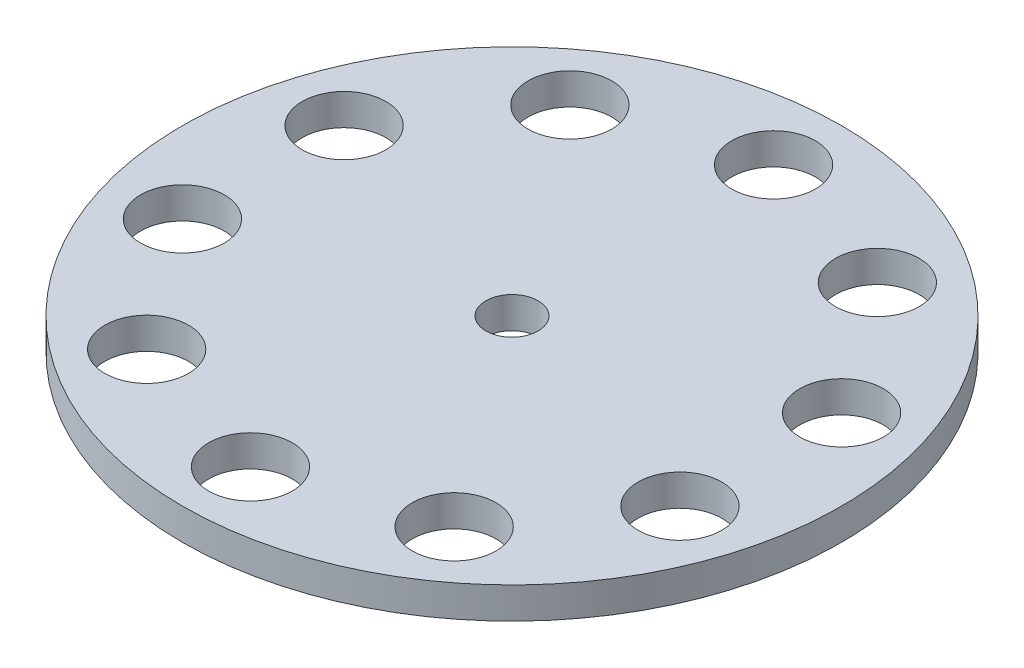
ISO-10303-21;
HEADER;
FILE_DESCRIPTION(('STEP AP214'),'2;1');
FILE_NAME('part.step','',(''),(''),'','','');
FILE_SCHEMA(('AUTOMOTIVE_DESIGN { 1 0 10303 214 1 1 1 1 }'));
ENDSEC;
DATA;
#1=APPLICATION_CONTEXT('core data for automotive mechanical design processes');
#2=APPLICATION_PROTOCOL_DEFINITION('international standard','automotive_design',2000,#1);
#3=PRODUCT_CONTEXT('',#1,'mechanical');
#4=PRODUCT('Part','Part','',(#3));
#5=PRODUCT_RELATED_PRODUCT_CATEGORY('part','',(#4));
#6=PRODUCT_DEFINITION_FORMATION('','',#4);
#7=PRODUCT_DEFINITION_CONTEXT('part definition',#1,'design');
#8=PRODUCT_DEFINITION('design','',#6,#7);
#9=PRODUCT_DEFINITION_SHAPE('','',#8);
#10=(LENGTH_UNIT() NAMED_UNIT(*) SI_UNIT(.MILLI.,.METRE.));
#11=(NAMED_UNIT(*) PLANE_ANGLE_UNIT() SI_UNIT($,.RADIAN.));
#12=(NAMED_UNIT(*) SI_UNIT($,.STERADIAN.) SOLID_ANGLE_UNIT());
#13=UNCERTAINTY_MEASURE_WITH_UNIT(LENGTH_MEASURE(1.E-05),#10,'distance_accuracy_value','');
#14=(GEOMETRIC_REPRESENTATION_CONTEXT(3) GLOBAL_UNCERTAINTY_ASSIGNED_CONTEXT((#13)) GLOBAL_UNIT_ASSIGNED_CONTEXT((#10,
#11,#12)) REPRESENTATION_CONTEXT('',''));
#15=CARTESIAN_POINT('',(0.,0.,0.));
#16=DIRECTION('',(0.,0.,1.));
#17=DIRECTION('',(1.,0.,0.));
#18=AXIS2_PLACEMENT_3D('',#15,#16,#17);
#19=CARTESIAN_POINT('',(0.,3.,0.));
#20=DIRECTION('',(0.,1.,0.));
#21=DIRECTION('',(0.,0.,1.));
#22=AXIS2_PLACEMENT_3D('',#19,#20,#21);
#23=PLANE('',#22);
#24=CARTESIAN_POINT('',(-14.6946313073118,3.,-20.2254248593737));
#25=DIRECTION('',(0.,1.,0.));
#26=DIRECTION('',(0.,0.,1.));
#27=AXIS2_PLACEMENT_3D('',#24,#25,#26);
#28=CIRCLE('',#27,4.);
#29=CARTESIAN_POINT('',(-14.6946313073118,3.,-16.2254248593737));
#30=VERTEX_POINT('',#29);
#31=EDGE_CURVE('E120',#30,#30,#28,.T.);
#32=ORIENTED_EDGE('',*,*,#31,.F.);
#33=EDGE_LOOP('',(#32));
#34=FACE_BOUND('',#33,.T.);
#35=CARTESIAN_POINT('',(-23.7764129073788,3.,7.72542485937369));
#36=DIRECTION('',(0.,1.,0.));
#37=DIRECTION('',(0.,0.,1.));
#38=AXIS2_PLACEMENT_3D('',#35,#36,#37);
#39=CIRCLE('',#38,4.);
#40=CARTESIAN_POINT('',(-23.7764129073788,3.,11.7254248593737));
#41=VERTEX_POINT('',#40);
#42=EDGE_CURVE('E104',#41,#41,#39,.T.);
#43=ORIENTED_EDGE('',*,*,#42,.F.);
#44=EDGE_LOOP('',(#43));
#45=FACE_BOUND('',#44,.T.);
#46=CARTESIAN_POINT('',(0.,3.,25.));
#47=DIRECTION('',(0.,1.,0.));
#48=DIRECTION('',(0.,0.,1.));
#49=AXIS2_PLACEMENT_3D('',#46,#47,#48);
#50=CIRCLE('',#49,4.);
#51=CARTESIAN_POINT('',(0.,3.,29.));
#52=VERTEX_POINT('',#51);
#53=EDGE_CURVE('E88',#52,#52,#50,.T.);
#54=ORIENTED_EDGE('',*,*,#53,.F.);
#55=EDGE_LOOP('',(#54));
#56=FACE_BOUND('',#55,.T.);
#57=CARTESIAN_POINT('',(23.7764129073788,3.,7.72542485937368));
#58=DIRECTION('',(0.,1.,0.));
#59=DIRECTION('',(0.,0.,1.));
#60=AXIS2_PLACEMENT_3D('',#57,#58,#59);
#61=CIRCLE('',#60,4.);
#62=CARTESIAN_POINT('',(23.7764129073788,3.,11.7254248593737));
#63=VERTEX_POINT('',#62);
#64=EDGE_CURVE('E72',#63,#63,#61,.T.);
#65=ORIENTED_EDGE('',*,*,#64,.F.);
#66=EDGE_LOOP('',(#65));
#67=FACE_BOUND('',#66,.T.);
#68=CARTESIAN_POINT('',(14.6946313073118,3.,-20.2254248593737));
#69=DIRECTION('',(0.,1.,0.));
#70=DIRECTION('',(0.,0.,1.));
#71=AXIS2_PLACEMENT_3D('',#68,#69,#70);
#72=CIRCLE('',#71,4.);
#73=CARTESIAN_POINT('',(14.6946313073118,3.,-16.2254248593737));
#74=VERTEX_POINT('',#73);
#75=EDGE_CURVE('E56',#74,#74,#72,.T.);
#76=ORIENTED_EDGE('',*,*,#75,.F.);
#77=EDGE_LOOP('',(#76));
#78=FACE_BOUND('',#77,.T.);
#79=CARTESIAN_POINT('',(0.,3.,0.));
#80=DIRECTION('',(0.,1.,0.));
#81=DIRECTION('',(0.,0.,1.));
#82=AXIS2_PLACEMENT_3D('',#79,#80,#81);
#83=CIRCLE('',#82,31.5);
#84=CARTESIAN_POINT('',(0.,3.,31.5));
#85=VERTEX_POINT('',#84);
#86=EDGE_CURVE('E10',#85,#85,#83,.T.);
#87=ORIENTED_EDGE('',*,*,#86,.T.);
#88=EDGE_LOOP('',(#87));
#89=FACE_BOUND('',#88,.T.);
#90=CARTESIAN_POINT('',(0.,3.,-25.));
#91=DIRECTION('',(0.,1.,0.));
#92=DIRECTION('',(0.,0.,1.));
#93=AXIS2_PLACEMENT_3D('',#90,#91,#92);
#94=CIRCLE('',#93,4.);
#95=CARTESIAN_POINT('',(0.,3.,-21.));
#96=VERTEX_POINT('',#95);
#97=EDGE_CURVE('E50',#96,#96,#94,.T.);
#98=ORIENTED_EDGE('',*,*,#97,.F.);
#99=EDGE_LOOP('',(#98));
#100=FACE_BOUND('',#99,.T.);
#101=CARTESIAN_POINT('',(23.7764129073788,3.,-7.72542485937369));
#102=DIRECTION('',(0.,1.,0.));
#103=DIRECTION('',(0.,0.,1.));
#104=AXIS2_PLACEMENT_3D('',#101,#102,#103);
#105=CIRCLE('',#104,4.);
#106=CARTESIAN_POINT('',(23.7764129073788,3.,-3.72542485937369));
#107=VERTEX_POINT('',#106);
#108=EDGE_CURVE('E64',#107,#107,#105,.T.);
#109=ORIENTED_EDGE('',*,*,#108,.F.);
#110=EDGE_LOOP('',(#109));
#111=FACE_BOUND('',#110,.T.);
#112=CARTESIAN_POINT('',(14.6946313073118,3.,20.2254248593737));
#113=DIRECTION('',(0.,1.,0.));
#114=DIRECTION('',(0.,0.,1.));
#115=AXIS2_PLACEMENT_3D('',#112,#113,#114);
#116=CIRCLE('',#115,4.);
#117=CARTESIAN_POINT('',(14.6946313073118,3.,24.2254248593737));
#118=VERTEX_POINT('',#117);
#119=EDGE_CURVE('E80',#118,#118,#116,.T.);
#120=ORIENTED_EDGE('',*,*,#119,.F.);
#121=EDGE_LOOP('',(#120));
#122=FACE_BOUND('',#121,.T.);
#123=CARTESIAN_POINT('',(-14.6946313073118,3.,20.2254248593737));
#124=DIRECTION('',(0.,1.,0.));
#125=DIRECTION('',(0.,0.,1.));
#126=AXIS2_PLACEMENT_3D('',#123,#124,#125);
#127=CIRCLE('',#126,4.);
#128=CARTESIAN_POINT('',(-14.6946313073118,3.,24.2254248593737));
#129=VERTEX_POINT('',#128);
#130=EDGE_CURVE('E96',#129,#129,#127,.T.);
#131=ORIENTED_EDGE('',*,*,#130,.F.);
#132=EDGE_LOOP('',(#131));
#133=FACE_BOUND('',#132,.T.);
#134=CARTESIAN_POINT('',(-23.7764129073788,3.,-7.72542485937368));
#135=DIRECTION('',(0.,1.,0.));
#136=DIRECTION('',(0.,0.,1.));
#137=AXIS2_PLACEMENT_3D('',#134,#135,#136);
#138=CIRCLE('',#137,4.);
#139=CARTESIAN_POINT('',(-23.7764129073788,3.,-3.72542485937368));
#140=VERTEX_POINT('',#139);
#141=EDGE_CURVE('E112',#140,#140,#138,.T.);
#142=ORIENTED_EDGE('',*,*,#141,.F.);
#143=EDGE_LOOP('',(#142));
#144=FACE_BOUND('',#143,.T.);
#145=CARTESIAN_POINT('',(0.,3.,0.));
#146=DIRECTION('',(0.,1.,0.));
#147=DIRECTION('',(0.,0.,1.));
#148=AXIS2_PLACEMENT_3D('',#145,#146,#147);
#149=CIRCLE('',#148,2.5);
#150=CARTESIAN_POINT('',(0.,3.,2.5));
#151=VERTEX_POINT('',#150);
#152=EDGE_CURVE('E128',#151,#151,#149,.T.);
#153=ORIENTED_EDGE('',*,*,#152,.F.);
#154=EDGE_LOOP('',(#153));
#155=FACE_BOUND('',#154,.T.);
#156=ADVANCED_FACE('F37',(#34,#45,#56,#67,#78,#89,#100,#111,#122,#133,#144,#155),#23,.T.);
#157=CARTESIAN_POINT('',(0.,0.,0.));
#158=DIRECTION('',(0.,1.,0.));
#159=DIRECTION('',(0.,0.,1.));
#160=AXIS2_PLACEMENT_3D('',#157,#158,#159);
#161=PLANE('',#160);
#162=CARTESIAN_POINT('',(0.,0.,0.));
#163=DIRECTION('',(0.,1.,0.));
#164=DIRECTION('',(0.,0.,1.));
#165=AXIS2_PLACEMENT_3D('',#162,#163,#164);
#166=CIRCLE('',#165,31.5);
#167=CARTESIAN_POINT('',(0.,0.,31.5));
#168=VERTEX_POINT('',#167);
#169=EDGE_CURVE('E41',#168,#168,#166,.T.);
#170=ORIENTED_EDGE('',*,*,#169,.F.);
#171=EDGE_LOOP('',(#170));
#172=FACE_BOUND('',#171,.T.);
#173=CARTESIAN_POINT('',(0.,0.,-25.));
#174=DIRECTION('',(0.,1.,0.));
#175=DIRECTION('',(0.,0.,1.));
#176=AXIS2_PLACEMENT_3D('',#173,#174,#175);
#177=CIRCLE('',#176,4.);
#178=CARTESIAN_POINT('',(0.,0.,-21.));
#179=VERTEX_POINT('',#178);
#180=EDGE_CURVE('E52',#179,#179,#177,.T.);
#181=ORIENTED_EDGE('',*,*,#180,.T.);
#182=EDGE_LOOP('',(#181));
#183=FACE_BOUND('',#182,.T.);
#184=CARTESIAN_POINT('',(14.6946313073118,0.,-20.2254248593737));
#185=DIRECTION('',(0.,1.,0.));
#186=DIRECTION('',(0.,0.,1.));
#187=AXIS2_PLACEMENT_3D('',#184,#185,#186);
#188=CIRCLE('',#187,4.);
#189=CARTESIAN_POINT('',(14.6946313073118,0.,-16.2254248593737));
#190=VERTEX_POINT('',#189);
#191=EDGE_CURVE('E60',#190,#190,#188,.T.);
#192=ORIENTED_EDGE('',*,*,#191,.T.);
#193=EDGE_LOOP('',(#192));
#194=FACE_BOUND('',#193,.T.);
#195=CARTESIAN_POINT('',(23.7764129073788,0.,-7.72542485937369));
#196=DIRECTION('',(0.,1.,0.));
#197=DIRECTION('',(0.,0.,1.));
#198=AXIS2_PLACEMENT_3D('',#195,#196,#197);
#199=CIRCLE('',#198,4.);
#200=CARTESIAN_POINT('',(23.7764129073788,0.,-3.72542485937369));
#201=VERTEX_POINT('',#200);
#202=EDGE_CURVE('E68',#201,#201,#199,.T.);
#203=ORIENTED_EDGE('',*,*,#202,.T.);
#204=EDGE_LOOP('',(#203));
#205=FACE_BOUND('',#204,.T.);
#206=CARTESIAN_POINT('',(23.7764129073788,0.,7.72542485937368));
#207=DIRECTION('',(0.,1.,0.));
#208=DIRECTION('',(0.,0.,1.));
#209=AXIS2_PLACEMENT_3D('',#206,#207,#208);
#210=CIRCLE('',#209,4.);
#211=CARTESIAN_POINT('',(23.7764129073788,0.,11.7254248593737));
#212=VERTEX_POINT('',#211);
#213=EDGE_CURVE('E76',#212,#212,#210,.T.);
#214=ORIENTED_EDGE('',*,*,#213,.T.);
#215=EDGE_LOOP('',(#214));
#216=FACE_BOUND('',#215,.T.);
#217=CARTESIAN_POINT('',(14.6946313073118,0.,20.2254248593737));
#218=DIRECTION('',(0.,1.,0.));
#219=DIRECTION('',(0.,0.,1.));
#220=AXIS2_PLACEMENT_3D('',#217,#218,#219);
#221=CIRCLE('',#220,4.);
#222=CARTESIAN_POINT('',(14.6946313073118,0.,24.2254248593737));
#223=VERTEX_POINT('',#222);
#224=EDGE_CURVE('E84',#223,#223,#221,.T.);
#225=ORIENTED_EDGE('',*,*,#224,.T.);
#226=EDGE_LOOP('',(#225));
#227=FACE_BOUND('',#226,.T.);
#228=CARTESIAN_POINT('',(0.,0.,25.));
#229=DIRECTION('',(0.,1.,0.));
#230=DIRECTION('',(0.,0.,1.));
#231=AXIS2_PLACEMENT_3D('',#228,#229,#230);
#232=CIRCLE('',#231,4.);
#233=CARTESIAN_POINT('',(0.,0.,29.));
#234=VERTEX_POINT('',#233);
#235=EDGE_CURVE('E92',#234,#234,#232,.T.);
#236=ORIENTED_EDGE('',*,*,#235,.T.);
#237=EDGE_LOOP('',(#236));
#238=FACE_BOUND('',#237,.T.);
#239=CARTESIAN_POINT('',(-14.6946313073118,0.,20.2254248593737));
#240=DIRECTION('',(0.,1.,0.));
#241=DIRECTION('',(0.,0.,1.));
#242=AXIS2_PLACEMENT_3D('',#239,#240,#241);
#243=CIRCLE('',#242,4.);
#244=CARTESIAN_POINT('',(-14.6946313073118,0.,24.2254248593737));
#245=VERTEX_POINT('',#244);
#246=EDGE_CURVE('E100',#245,#245,#243,.T.);
#247=ORIENTED_EDGE('',*,*,#246,.T.);
#248=EDGE_LOOP('',(#247));
#249=FACE_BOUND('',#248,.T.);
#250=CARTESIAN_POINT('',(-23.7764129073788,0.,7.72542485937369));
#251=DIRECTION('',(0.,1.,0.));
#252=DIRECTION('',(0.,0.,1.));
#253=AXIS2_PLACEMENT_3D('',#250,#251,#252);
#254=CIRCLE('',#253,4.);
#255=CARTESIAN_POINT('',(-23.7764129073788,0.,11.7254248593737));
#256=VERTEX_POINT('',#255);
#257=EDGE_CURVE('E108',#256,#256,#254,.T.);
#258=ORIENTED_EDGE('',*,*,#257,.T.);
#259=EDGE_LOOP('',(#258));
#260=FACE_BOUND('',#259,.T.);
#261=CARTESIAN_POINT('',(-23.7764129073788,0.,-7.72542485937368));
#262=DIRECTION('',(0.,1.,0.));
#263=DIRECTION('',(0.,0.,1.));
#264=AXIS2_PLACEMENT_3D('',#261,#262,#263);
#265=CIRCLE('',#264,4.);
#266=CARTESIAN_POINT('',(-23.7764129073788,0.,-3.72542485937368));
#267=VERTEX_POINT('',#266);
#268=EDGE_CURVE('E116',#267,#267,#265,.T.);
#269=ORIENTED_EDGE('',*,*,#268,.T.);
#270=EDGE_LOOP('',(#269));
#271=FACE_BOUND('',#270,.T.);
#272=CARTESIAN_POINT('',(-14.6946313073118,0.,-20.2254248593737));
#273=DIRECTION('',(0.,1.,0.));
#274=DIRECTION('',(0.,0.,1.));
#275=AXIS2_PLACEMENT_3D('',#272,#273,#274);
#276=CIRCLE('',#275,4.);
#277=CARTESIAN_POINT('',(-14.6946313073118,0.,-16.2254248593737));
#278=VERTEX_POINT('',#277);
#279=EDGE_CURVE('E124',#278,#278,#276,.T.);
#280=ORIENTED_EDGE('',*,*,#279,.T.);
#281=EDGE_LOOP('',(#280));
#282=FACE_BOUND('',#281,.T.);
#283=CARTESIAN_POINT('',(0.,0.,0.));
#284=DIRECTION('',(0.,1.,0.));
#285=DIRECTION('',(0.,0.,1.));
#286=AXIS2_PLACEMENT_3D('',#283,#284,#285);
#287=CIRCLE('',#286,2.5);
#288=CARTESIAN_POINT('',(0.,0.,2.5));
#289=VERTEX_POINT('',#288);
#290=EDGE_CURVE('E132',#289,#289,#287,.T.);
#291=ORIENTED_EDGE('',*,*,#290,.T.);
#292=EDGE_LOOP('',(#291));
#293=FACE_BOUND('',#292,.T.);
#294=ADVANCED_FACE('F144',(#172,#183,#194,#205,#216,#227,#238,#249,#260,#271,#282,#293),#161,.F.);
#295=CARTESIAN_POINT('',(0.,3.,0.));
#296=DIRECTION('',(0.,-1.,0.));
#297=DIRECTION('',(0.,0.,-1.));
#298=AXIS2_PLACEMENT_3D('',#295,#296,#297);
#299=CYLINDRICAL_SURFACE('',#298,31.5);
#300=ORIENTED_EDGE('',*,*,#86,.F.);
#301=EDGE_LOOP('',(#300));
#302=FACE_BOUND('',#301,.T.);
#303=ORIENTED_EDGE('',*,*,#169,.T.);
#304=EDGE_LOOP('',(#303));
#305=FACE_BOUND('',#304,.T.);
#306=ADVANCED_FACE('F39',(#302,#305),#299,.T.);
#307=CARTESIAN_POINT('',(0.,3.,-25.));
#308=DIRECTION('',(0.,-1.,0.));
#309=DIRECTION('',(0.,0.,-1.));
#310=AXIS2_PLACEMENT_3D('',#307,#308,#309);
#311=CYLINDRICAL_SURFACE('',#310,4.);
#312=ORIENTED_EDGE('',*,*,#97,.T.);
#313=EDGE_LOOP('',(#312));
#314=FACE_BOUND('',#313,.T.);
#315=ORIENTED_EDGE('',*,*,#180,.F.);
#316=EDGE_LOOP('',(#315));
#317=FACE_BOUND('',#316,.T.);
#318=ADVANCED_FACE('F154',(#314,#317),#311,.F.);
#319=CARTESIAN_POINT('',(14.6946313073118,3.,-20.2254248593737));
#320=DIRECTION('',(0.,-1.,0.));
#321=DIRECTION('',(0.,0.,-1.));
#322=AXIS2_PLACEMENT_3D('',#319,#320,#321);
#323=CYLINDRICAL_SURFACE('',#322,4.);
#324=ORIENTED_EDGE('',*,*,#75,.T.);
#325=EDGE_LOOP('',(#324));
#326=FACE_BOUND('',#325,.T.);
#327=ORIENTED_EDGE('',*,*,#191,.F.);
#328=EDGE_LOOP('',(#327));
#329=FACE_BOUND('',#328,.T.);
#330=ADVANCED_FACE('F157',(#326,#329),#323,.F.);
#331=CARTESIAN_POINT('',(23.7764129073788,3.,-7.72542485937369));
#332=DIRECTION('',(0.,-1.,0.));
#333=DIRECTION('',(0.,0.,-1.));
#334=AXIS2_PLACEMENT_3D('',#331,#332,#333);
#335=CYLINDRICAL_SURFACE('',#334,4.);
#336=ORIENTED_EDGE('',*,*,#108,.T.);
#337=EDGE_LOOP('',(#336));
#338=FACE_BOUND('',#337,.T.);
#339=ORIENTED_EDGE('',*,*,#202,.F.);
#340=EDGE_LOOP('',(#339));
#341=FACE_BOUND('',#340,.T.);
#342=ADVANCED_FACE('F161',(#338,#341),#335,.F.);
#343=CARTESIAN_POINT('',(23.7764129073788,3.,7.72542485937368));
#344=DIRECTION('',(0.,-1.,0.));
#345=DIRECTION('',(0.,0.,-1.));
#346=AXIS2_PLACEMENT_3D('',#343,#344,#345);
#347=CYLINDRICAL_SURFACE('',#346,4.);
#348=ORIENTED_EDGE('',*,*,#64,.T.);
#349=EDGE_LOOP('',(#348));
#350=FACE_BOUND('',#349,.T.);
#351=ORIENTED_EDGE('',*,*,#213,.F.);
#352=EDGE_LOOP('',(#351));
#353=FACE_BOUND('',#352,.T.);
#354=ADVANCED_FACE('F165',(#350,#353),#347,.F.);
#355=CARTESIAN_POINT('',(14.6946313073118,3.,20.2254248593737));
#356=DIRECTION('',(0.,-1.,0.));
#357=DIRECTION('',(0.,0.,-1.));
#358=AXIS2_PLACEMENT_3D('',#355,#356,#357);
#359=CYLINDRICAL_SURFACE('',#358,4.);
#360=ORIENTED_EDGE('',*,*,#119,.T.);
#361=EDGE_LOOP('',(#360));
#362=FACE_BOUND('',#361,.T.);
#363=ORIENTED_EDGE('',*,*,#224,.F.);
#364=EDGE_LOOP('',(#363));
#365=FACE_BOUND('',#364,.T.);
#366=ADVANCED_FACE('F169',(#362,#365),#359,.F.);
#367=CARTESIAN_POINT('',(0.,3.,25.));
#368=DIRECTION('',(0.,-1.,0.));
#369=DIRECTION('',(0.,0.,-1.));
#370=AXIS2_PLACEMENT_3D('',#367,#368,#369);
#371=CYLINDRICAL_SURFACE('',#370,4.);
#372=ORIENTED_EDGE('',*,*,#53,.T.);
#373=EDGE_LOOP('',(#372));
#374=FACE_BOUND('',#373,.T.);
#375=ORIENTED_EDGE('',*,*,#235,.F.);
#376=EDGE_LOOP('',(#375));
#377=FACE_BOUND('',#376,.T.);
#378=ADVANCED_FACE('F173',(#374,#377),#371,.F.);
#379=CARTESIAN_POINT('',(-14.6946313073118,3.,20.2254248593737));
#380=DIRECTION('',(0.,-1.,0.));
#381=DIRECTION('',(0.,0.,-1.));
#382=AXIS2_PLACEMENT_3D('',#379,#380,#381);
#383=CYLINDRICAL_SURFACE('',#382,4.);
#384=ORIENTED_EDGE('',*,*,#130,.T.);
#385=EDGE_LOOP('',(#384));
#386=FACE_BOUND('',#385,.T.);
#387=ORIENTED_EDGE('',*,*,#246,.F.);
#388=EDGE_LOOP('',(#387));
#389=FACE_BOUND('',#388,.T.);
#390=ADVANCED_FACE('F177',(#386,#389),#383,.F.);
#391=CARTESIAN_POINT('',(-23.7764129073788,3.,7.72542485937369));
#392=DIRECTION('',(0.,-1.,0.));
#393=DIRECTION('',(0.,0.,-1.));
#394=AXIS2_PLACEMENT_3D('',#391,#392,#393);
#395=CYLINDRICAL_SURFACE('',#394,4.);
#396=ORIENTED_EDGE('',*,*,#42,.T.);
#397=EDGE_LOOP('',(#396));
#398=FACE_BOUND('',#397,.T.);
#399=ORIENTED_EDGE('',*,*,#257,.F.);
#400=EDGE_LOOP('',(#399));
#401=FACE_BOUND('',#400,.T.);
#402=ADVANCED_FACE('F181',(#398,#401),#395,.F.);
#403=CARTESIAN_POINT('',(-23.7764129073788,3.,-7.72542485937368));
#404=DIRECTION('',(0.,-1.,0.));
#405=DIRECTION('',(0.,0.,-1.));
#406=AXIS2_PLACEMENT_3D('',#403,#404,#405);
#407=CYLINDRICAL_SURFACE('',#406,4.);
#408=ORIENTED_EDGE('',*,*,#141,.T.);
#409=EDGE_LOOP('',(#408));
#410=FACE_BOUND('',#409,.T.);
#411=ORIENTED_EDGE('',*,*,#268,.F.);
#412=EDGE_LOOP('',(#411));
#413=FACE_BOUND('',#412,.T.);
#414=ADVANCED_FACE('F185',(#410,#413),#407,.F.);
#415=CARTESIAN_POINT('',(-14.6946313073118,3.,-20.2254248593737));
#416=DIRECTION('',(0.,-1.,0.));
#417=DIRECTION('',(0.,0.,-1.));
#418=AXIS2_PLACEMENT_3D('',#415,#416,#417);
#419=CYLINDRICAL_SURFACE('',#418,4.);
#420=ORIENTED_EDGE('',*,*,#31,.T.);
#421=EDGE_LOOP('',(#420));
#422=FACE_BOUND('',#421,.T.);
#423=ORIENTED_EDGE('',*,*,#279,.F.);
#424=EDGE_LOOP('',(#423));
#425=FACE_BOUND('',#424,.T.);
#426=ADVANCED_FACE('F189',(#422,#425),#419,.F.);
#427=CARTESIAN_POINT('',(0.,3.,0.));
#428=DIRECTION('',(0.,-1.,0.));
#429=DIRECTION('',(0.,0.,-1.));
#430=AXIS2_PLACEMENT_3D('',#427,#428,#429);
#431=CYLINDRICAL_SURFACE('',#430,2.5);
#432=ORIENTED_EDGE('',*,*,#152,.T.);
#433=EDGE_LOOP('',(#432));
#434=FACE_BOUND('',#433,.T.);
#435=ORIENTED_EDGE('',*,*,#290,.F.);
#436=EDGE_LOOP('',(#435));
#437=FACE_BOUND('',#436,.T.);
#438=ADVANCED_FACE('F140',(#434,#437),#431,.F.);
#439=CLOSED_SHELL('',(#156,#294,#306,#318,#330,#342,#354,#366,#378,#390,#402,#414,#426,#438));
#440=MANIFOLD_SOLID_BREP('B2',#439);
#441=ADVANCED_BREP_SHAPE_REPRESENTATION('',(#18,#440),#14);
#442=SHAPE_DEFINITION_REPRESENTATION(#9,#441);
ENDSEC;
END-ISO-10303-21;
